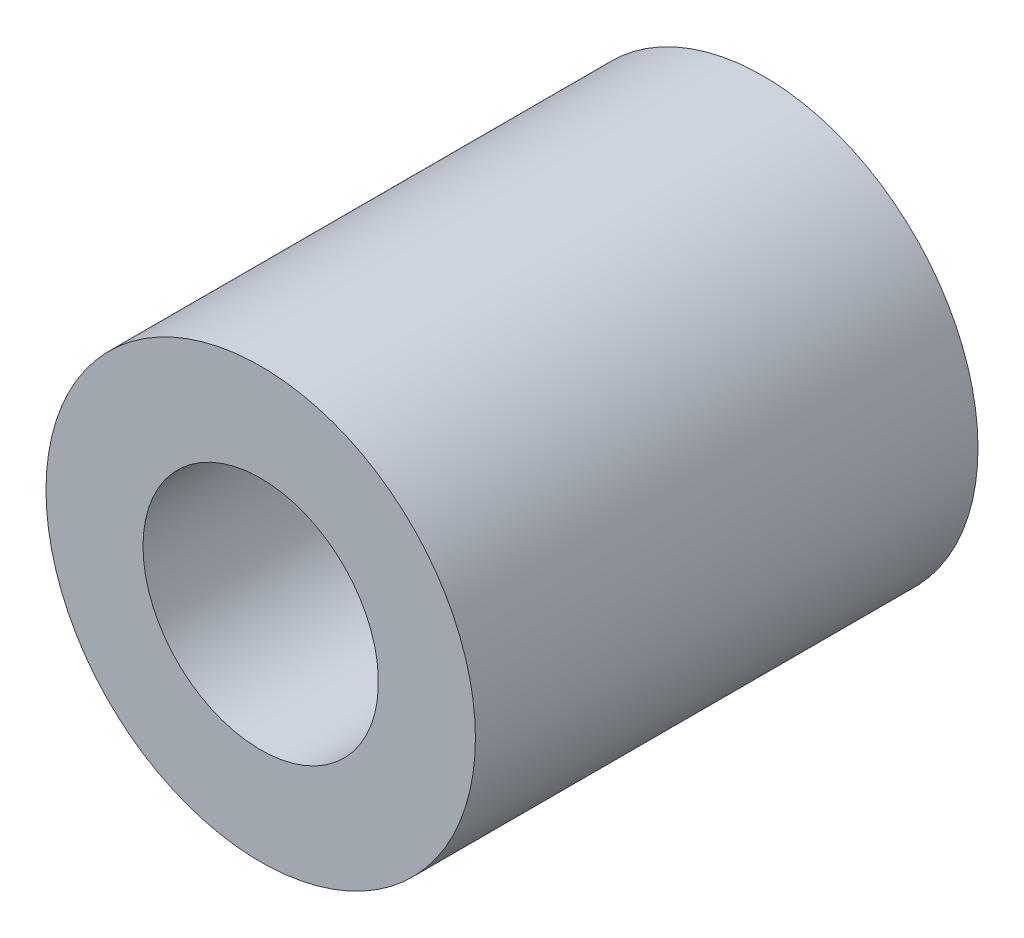
ISO-10303-21;
HEADER;
FILE_DESCRIPTION(('STEP AP214'),'2;1');
FILE_NAME('part.step','',(''),(''),'','','');
FILE_SCHEMA(('AUTOMOTIVE_DESIGN { 1 0 10303 214 1 1 1 1 }'));
ENDSEC;
DATA;
#1=APPLICATION_CONTEXT('core data for automotive mechanical design processes');
#2=APPLICATION_PROTOCOL_DEFINITION('international standard','automotive_design',2000,#1);
#3=PRODUCT_CONTEXT('',#1,'mechanical');
#4=PRODUCT('Part','Part','',(#3));
#5=PRODUCT_RELATED_PRODUCT_CATEGORY('part','',(#4));
#6=PRODUCT_DEFINITION_FORMATION('','',#4);
#7=PRODUCT_DEFINITION_CONTEXT('part definition',#1,'design');
#8=PRODUCT_DEFINITION('design','',#6,#7);
#9=PRODUCT_DEFINITION_SHAPE('','',#8);
#10=(LENGTH_UNIT() NAMED_UNIT(*) SI_UNIT(.MILLI.,.METRE.));
#11=(NAMED_UNIT(*) PLANE_ANGLE_UNIT() SI_UNIT($,.RADIAN.));
#12=(NAMED_UNIT(*) SI_UNIT($,.STERADIAN.) SOLID_ANGLE_UNIT());
#13=UNCERTAINTY_MEASURE_WITH_UNIT(LENGTH_MEASURE(1.E-05),#10,'distance_accuracy_value','');
#14=(GEOMETRIC_REPRESENTATION_CONTEXT(3) GLOBAL_UNCERTAINTY_ASSIGNED_CONTEXT((#13)) GLOBAL_UNIT_ASSIGNED_CONTEXT((#10,
#11,#12)) REPRESENTATION_CONTEXT('',''));
#15=CARTESIAN_POINT('',(0.,0.,0.));
#16=DIRECTION('',(0.,0.,1.));
#17=DIRECTION('',(1.,0.,0.));
#18=AXIS2_PLACEMENT_3D('',#15,#16,#17);
#19=CARTESIAN_POINT('',(0.,0.,-8.3));
#20=DIRECTION('',(0.,0.,-1.));
#21=DIRECTION('',(-1.,0.,0.));
#22=AXIS2_PLACEMENT_3D('',#19,#20,#21);
#23=CYLINDRICAL_SURFACE('',#22,1.85);
#24=CARTESIAN_POINT('',(0.,0.,-8.3));
#25=DIRECTION('',(0.,0.,-1.));
#26=DIRECTION('',(-1.,0.,0.));
#27=AXIS2_PLACEMENT_3D('',#24,#25,#26);
#28=CIRCLE('',#27,1.85);
#29=CARTESIAN_POINT('',(-1.85,0.,-8.3));
#30=VERTEX_POINT('',#29);
#31=EDGE_CURVE('E18',#30,#30,#28,.T.);
#32=ORIENTED_EDGE('',*,*,#31,.T.);
#33=EDGE_LOOP('',(#32));
#34=FACE_BOUND('',#33,.T.);
#35=CARTESIAN_POINT('',(0.,0.,-0.399999999999999));
#36=DIRECTION('',(0.,0.,-1.));
#37=DIRECTION('',(-1.,0.,0.));
#38=AXIS2_PLACEMENT_3D('',#35,#36,#37);
#39=CIRCLE('',#38,1.85);
#40=CARTESIAN_POINT('',(-1.85,0.,-0.399999999999999));
#41=VERTEX_POINT('',#40);
#42=EDGE_CURVE('E27',#41,#41,#39,.T.);
#43=ORIENTED_EDGE('',*,*,#42,.F.);
#44=EDGE_LOOP('',(#43));
#45=FACE_BOUND('',#44,.T.);
#46=ADVANCED_FACE('F15',(#34,#45),#23,.F.);
#47=CARTESIAN_POINT('',(0.,0.,-8.3));
#48=DIRECTION('',(0.,0.,1.));
#49=DIRECTION('',(1.,0.,0.));
#50=AXIS2_PLACEMENT_3D('',#47,#48,#49);
#51=PLANE('',#50);
#52=ORIENTED_EDGE('',*,*,#31,.F.);
#53=EDGE_LOOP('',(#52));
#54=FACE_BOUND('',#53,.T.);
#55=CARTESIAN_POINT('',(0.,0.,-8.3));
#56=DIRECTION('',(0.,0.,-1.));
#57=DIRECTION('',(-1.,0.,0.));
#58=AXIS2_PLACEMENT_3D('',#55,#56,#57);
#59=CIRCLE('',#58,3.375);
#60=CARTESIAN_POINT('',(-3.375,0.,-8.3));
#61=VERTEX_POINT('',#60);
#62=EDGE_CURVE('E22',#61,#61,#59,.F.);
#63=ORIENTED_EDGE('',*,*,#62,.F.);
#64=EDGE_LOOP('',(#63));
#65=FACE_BOUND('',#64,.T.);
#66=ADVANCED_FACE('F37',(#54,#65),#51,.F.);
#67=CARTESIAN_POINT('',(0.,0.,-0.4));
#68=DIRECTION('',(0.,0.,1.));
#69=DIRECTION('',(1.,0.,0.));
#70=AXIS2_PLACEMENT_3D('',#67,#68,#69);
#71=PLANE('',#70);
#72=ORIENTED_EDGE('',*,*,#42,.T.);
#73=EDGE_LOOP('',(#72));
#74=FACE_BOUND('',#73,.T.);
#75=CARTESIAN_POINT('',(0.,0.,-0.399999999999999));
#76=DIRECTION('',(0.,0.,-1.));
#77=DIRECTION('',(-1.,0.,0.));
#78=AXIS2_PLACEMENT_3D('',#75,#76,#77);
#79=CIRCLE('',#78,3.375);
#80=CARTESIAN_POINT('',(-3.375,0.,-0.399999999999999));
#81=VERTEX_POINT('',#80);
#82=EDGE_CURVE('E10',#81,#81,#79,.T.);
#83=ORIENTED_EDGE('',*,*,#82,.F.);
#84=EDGE_LOOP('',(#83));
#85=FACE_BOUND('',#84,.T.);
#86=ADVANCED_FACE('F40',(#74,#85),#71,.T.);
#87=CARTESIAN_POINT('',(0.,0.,-8.3));
#88=DIRECTION('',(0.,0.,-1.));
#89=DIRECTION('',(-1.,0.,0.));
#90=AXIS2_PLACEMENT_3D('',#87,#88,#89);
#91=CYLINDRICAL_SURFACE('',#90,3.375);
#92=ORIENTED_EDGE('',*,*,#82,.T.);
#93=EDGE_LOOP('',(#92));
#94=FACE_BOUND('',#93,.T.);
#95=ORIENTED_EDGE('',*,*,#62,.T.);
#96=EDGE_LOOP('',(#95));
#97=FACE_BOUND('',#96,.T.);
#98=ADVANCED_FACE('F43',(#94,#97),#91,.T.);
#99=CLOSED_SHELL('',(#46,#66,#86,#98));
#100=MANIFOLD_SOLID_BREP('B1',#99);
#101=ADVANCED_BREP_SHAPE_REPRESENTATION('',(#18,#100),#14);
#102=SHAPE_DEFINITION_REPRESENTATION(#9,#101);
ENDSEC;
END-ISO-10303-21;
